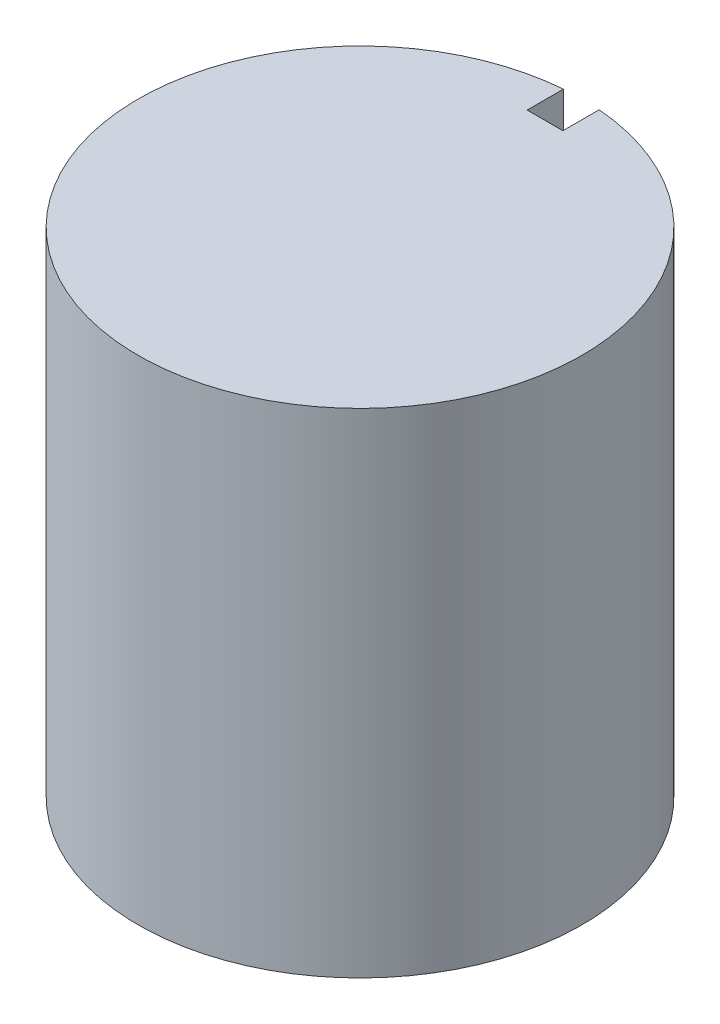
ISO-10303-21;
HEADER;
FILE_DESCRIPTION(('STEP AP214'),'2;1');
FILE_NAME('part.step','',(''),(''),'','','');
FILE_SCHEMA(('AUTOMOTIVE_DESIGN { 1 0 10303 214 1 1 1 1 }'));
ENDSEC;
DATA;
#1=APPLICATION_CONTEXT('core data for automotive mechanical design processes');
#2=APPLICATION_PROTOCOL_DEFINITION('international standard','automotive_design',2000,#1);
#3=PRODUCT_CONTEXT('',#1,'mechanical');
#4=PRODUCT('Part','Part','',(#3));
#5=PRODUCT_RELATED_PRODUCT_CATEGORY('part','',(#4));
#6=PRODUCT_DEFINITION_FORMATION('','',#4);
#7=PRODUCT_DEFINITION_CONTEXT('part definition',#1,'design');
#8=PRODUCT_DEFINITION('design','',#6,#7);
#9=PRODUCT_DEFINITION_SHAPE('','',#8);
#10=(LENGTH_UNIT() NAMED_UNIT(*) SI_UNIT(.MILLI.,.METRE.));
#11=(NAMED_UNIT(*) PLANE_ANGLE_UNIT() SI_UNIT($,.RADIAN.));
#12=(NAMED_UNIT(*) SI_UNIT($,.STERADIAN.) SOLID_ANGLE_UNIT());
#13=UNCERTAINTY_MEASURE_WITH_UNIT(LENGTH_MEASURE(1.E-05),#10,'distance_accuracy_value','');
#14=(GEOMETRIC_REPRESENTATION_CONTEXT(3) GLOBAL_UNCERTAINTY_ASSIGNED_CONTEXT((#13)) GLOBAL_UNIT_ASSIGNED_CONTEXT((#10,
#11,#12)) REPRESENTATION_CONTEXT('',''));
#15=CARTESIAN_POINT('',(0.,0.,0.));
#16=DIRECTION('',(0.,0.,1.));
#17=DIRECTION('',(1.,0.,0.));
#18=AXIS2_PLACEMENT_3D('',#15,#16,#17);
#19=CARTESIAN_POINT('',(-1.45,40.,0.));
#20=DIRECTION('',(-1.,0.,0.));
#21=DIRECTION('',(0.,0.,1.));
#22=AXIS2_PLACEMENT_3D('',#19,#20,#21);
#23=PLANE('',#22);
#24=DIRECTION('',(0.,0.,-1.));
#25=VECTOR('',#24,1.);
#26=CARTESIAN_POINT('',(-1.45,0.,0.));
#27=LINE('',#26,#25);
#28=CARTESIAN_POINT('',(-1.45,0.,-15.));
#29=VERTEX_POINT('',#28);
#30=CARTESIAN_POINT('',(-1.45,0.,-17.9415021667641));
#31=VERTEX_POINT('',#30);
#32=EDGE_CURVE('E97',#29,#31,#27,.T.);
#33=ORIENTED_EDGE('',*,*,#32,.T.);
#34=DIRECTION('',(0.,-1.,0.));
#35=VECTOR('',#34,1.);
#36=CARTESIAN_POINT('',(-1.45,40.,-17.9415021667641));
#37=LINE('',#36,#35);
#38=CARTESIAN_POINT('',(-1.45,40.,-17.9415021667641));
#39=VERTEX_POINT('',#38);
#40=EDGE_CURVE('E11',#39,#31,#37,.T.);
#41=ORIENTED_EDGE('',*,*,#40,.F.);
#42=DIRECTION('',(0.,0.,-1.));
#43=VECTOR('',#42,1.);
#44=CARTESIAN_POINT('',(-1.45,40.,0.));
#45=LINE('',#44,#43);
#46=CARTESIAN_POINT('',(-1.45,40.,-15.));
#47=VERTEX_POINT('',#46);
#48=EDGE_CURVE('E82',#47,#39,#45,.T.);
#49=ORIENTED_EDGE('',*,*,#48,.F.);
#50=DIRECTION('',(0.,-1.,0.));
#51=VECTOR('',#50,1.);
#52=CARTESIAN_POINT('',(-1.45,40.,-15.));
#53=LINE('',#52,#51);
#54=EDGE_CURVE('E93',#47,#29,#53,.T.);
#55=ORIENTED_EDGE('',*,*,#54,.T.);
#56=EDGE_LOOP('',(#33,#41,#49,#55));
#57=FACE_BOUND('',#56,.T.);
#58=ADVANCED_FACE('F35',(#57),#23,.F.);
#59=CARTESIAN_POINT('',(0.,40.,0.));
#60=DIRECTION('',(0.,-1.,0.));
#61=DIRECTION('',(0.,0.,-1.));
#62=AXIS2_PLACEMENT_3D('',#59,#60,#61);
#63=CYLINDRICAL_SURFACE('',#62,18.);
#64=CARTESIAN_POINT('',(0.,0.,0.));
#65=DIRECTION('',(0.,1.,0.));
#66=DIRECTION('',(0.,0.,1.));
#67=AXIS2_PLACEMENT_3D('',#64,#65,#66);
#68=CIRCLE('',#67,18.);
#69=CARTESIAN_POINT('',(1.45,0.,-17.9415021667641));
#70=VERTEX_POINT('',#69);
#71=EDGE_CURVE('E87',#31,#70,#68,.T.);
#72=ORIENTED_EDGE('',*,*,#71,.T.);
#73=DIRECTION('',(0.,-1.,0.));
#74=VECTOR('',#73,1.);
#75=CARTESIAN_POINT('',(1.45,40.,-17.9415021667641));
#76=LINE('',#75,#74);
#77=CARTESIAN_POINT('',(1.45,40.,-17.9415021667641));
#78=VERTEX_POINT('',#77);
#79=EDGE_CURVE('E43',#78,#70,#76,.T.);
#80=ORIENTED_EDGE('',*,*,#79,.F.);
#81=CARTESIAN_POINT('',(0.,40.,0.));
#82=DIRECTION('',(0.,1.,0.));
#83=DIRECTION('',(0.,0.,1.));
#84=AXIS2_PLACEMENT_3D('',#81,#82,#83);
#85=CIRCLE('',#84,18.);
#86=EDGE_CURVE('E77',#39,#78,#85,.T.);
#87=ORIENTED_EDGE('',*,*,#86,.F.);
#88=ORIENTED_EDGE('',*,*,#40,.T.);
#89=EDGE_LOOP('',(#72,#80,#87,#88));
#90=FACE_BOUND('',#89,.T.);
#91=ADVANCED_FACE('F86',(#90),#63,.T.);
#92=CARTESIAN_POINT('',(1.45,40.,0.));
#93=DIRECTION('',(-1.,0.,0.));
#94=DIRECTION('',(0.,0.,1.));
#95=AXIS2_PLACEMENT_3D('',#92,#93,#94);
#96=PLANE('',#95);
#97=DIRECTION('',(0.,0.,-1.));
#98=VECTOR('',#97,1.);
#99=CARTESIAN_POINT('',(1.45,0.,0.));
#100=LINE('',#99,#98);
#101=CARTESIAN_POINT('',(1.45,0.,-15.));
#102=VERTEX_POINT('',#101);
#103=EDGE_CURVE('E101',#102,#70,#100,.T.);
#104=ORIENTED_EDGE('',*,*,#103,.F.);
#105=DIRECTION('',(0.,-1.,0.));
#106=VECTOR('',#105,1.);
#107=CARTESIAN_POINT('',(1.45,40.,-15.));
#108=LINE('',#107,#106);
#109=CARTESIAN_POINT('',(1.45,40.,-15.));
#110=VERTEX_POINT('',#109);
#111=EDGE_CURVE('E67',#110,#102,#108,.T.);
#112=ORIENTED_EDGE('',*,*,#111,.F.);
#113=DIRECTION('',(0.,0.,-1.));
#114=VECTOR('',#113,1.);
#115=CARTESIAN_POINT('',(1.45,40.,0.));
#116=LINE('',#115,#114);
#117=EDGE_CURVE('E80',#110,#78,#116,.T.);
#118=ORIENTED_EDGE('',*,*,#117,.T.);
#119=ORIENTED_EDGE('',*,*,#79,.T.);
#120=EDGE_LOOP('',(#104,#112,#118,#119));
#121=FACE_BOUND('',#120,.T.);
#122=ADVANCED_FACE('F91',(#121),#96,.T.);
#123=CARTESIAN_POINT('',(0.,40.,-15.));
#124=DIRECTION('',(0.,0.,1.));
#125=DIRECTION('',(1.,0.,0.));
#126=AXIS2_PLACEMENT_3D('',#123,#124,#125);
#127=PLANE('',#126);
#128=DIRECTION('',(-1.,0.,0.));
#129=VECTOR('',#128,1.);
#130=CARTESIAN_POINT('',(0.,0.,-15.));
#131=LINE('',#130,#129);
#132=EDGE_CURVE('E70',#102,#29,#131,.T.);
#133=ORIENTED_EDGE('',*,*,#132,.T.);
#134=ORIENTED_EDGE('',*,*,#54,.F.);
#135=DIRECTION('',(-1.,0.,0.));
#136=VECTOR('',#135,1.);
#137=CARTESIAN_POINT('',(0.,40.,-15.));
#138=LINE('',#137,#136);
#139=EDGE_CURVE('E51',#110,#47,#138,.T.);
#140=ORIENTED_EDGE('',*,*,#139,.F.);
#141=ORIENTED_EDGE('',*,*,#111,.T.);
#142=EDGE_LOOP('',(#133,#134,#140,#141));
#143=FACE_BOUND('',#142,.T.);
#144=ADVANCED_FACE('F114',(#143),#127,.F.);
#145=CARTESIAN_POINT('',(0.,40.,0.));
#146=DIRECTION('',(0.,1.,0.));
#147=DIRECTION('',(0.,0.,1.));
#148=AXIS2_PLACEMENT_3D('',#145,#146,#147);
#149=PLANE('',#148);
#150=ORIENTED_EDGE('',*,*,#48,.T.);
#151=ORIENTED_EDGE('',*,*,#86,.T.);
#152=ORIENTED_EDGE('',*,*,#117,.F.);
#153=ORIENTED_EDGE('',*,*,#139,.T.);
#154=EDGE_LOOP('',(#150,#151,#152,#153));
#155=FACE_BOUND('',#154,.T.);
#156=ADVANCED_FACE('F78',(#155),#149,.T.);
#157=CARTESIAN_POINT('',(0.,0.,0.));
#158=DIRECTION('',(0.,1.,0.));
#159=DIRECTION('',(0.,0.,1.));
#160=AXIS2_PLACEMENT_3D('',#157,#158,#159);
#161=PLANE('',#160);
#162=ORIENTED_EDGE('',*,*,#32,.F.);
#163=ORIENTED_EDGE('',*,*,#132,.F.);
#164=ORIENTED_EDGE('',*,*,#103,.T.);
#165=ORIENTED_EDGE('',*,*,#71,.F.);
#166=EDGE_LOOP('',(#162,#163,#164,#165));
#167=FACE_BOUND('',#166,.T.);
#168=ADVANCED_FACE('F108',(#167),#161,.F.);
#169=CLOSED_SHELL('',(#58,#91,#122,#144,#156,#168));
#170=MANIFOLD_SOLID_BREP('B2',#169);
#171=ADVANCED_BREP_SHAPE_REPRESENTATION('',(#18,#170),#14);
#172=SHAPE_DEFINITION_REPRESENTATION(#9,#171);
ENDSEC;
END-ISO-10303-21;
